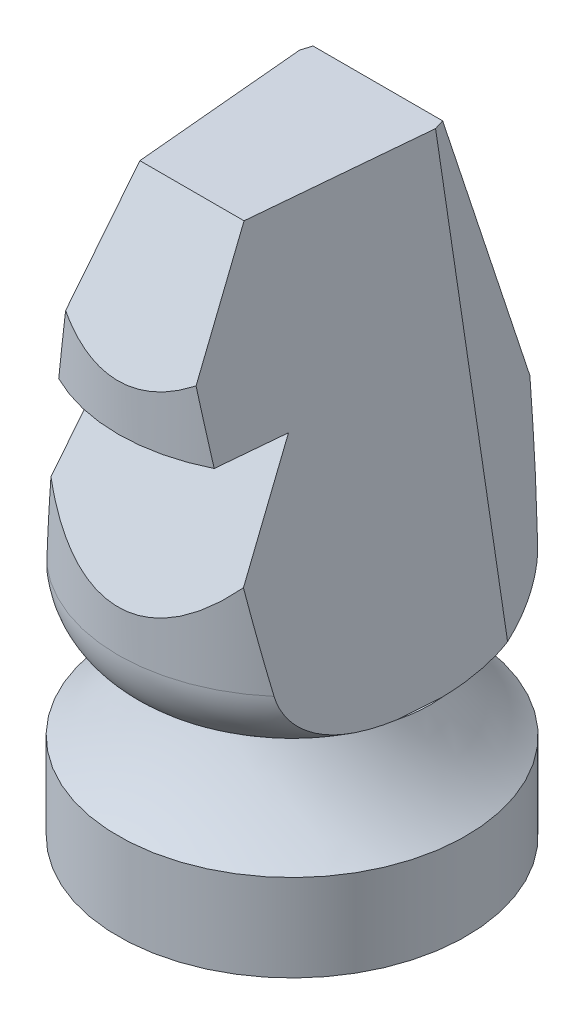
ISO-10303-21;
HEADER;
FILE_DESCRIPTION(('STEP AP214'),'2;1');
FILE_NAME('part.step','',(''),(''),'','','');
FILE_SCHEMA(('AUTOMOTIVE_DESIGN { 1 0 10303 214 1 1 1 1 }'));
ENDSEC;
DATA;
#1=APPLICATION_CONTEXT('core data for automotive mechanical design processes');
#2=APPLICATION_PROTOCOL_DEFINITION('international standard','automotive_design',2000,#1);
#3=PRODUCT_CONTEXT('',#1,'mechanical');
#4=PRODUCT('Part','Part','',(#3));
#5=PRODUCT_RELATED_PRODUCT_CATEGORY('part','',(#4));
#6=PRODUCT_DEFINITION_FORMATION('','',#4);
#7=PRODUCT_DEFINITION_CONTEXT('part definition',#1,'design');
#8=PRODUCT_DEFINITION('design','',#6,#7);
#9=PRODUCT_DEFINITION_SHAPE('','',#8);
#10=(LENGTH_UNIT() NAMED_UNIT(*) SI_UNIT(.MILLI.,.METRE.));
#11=(NAMED_UNIT(*) PLANE_ANGLE_UNIT() SI_UNIT($,.RADIAN.));
#12=(NAMED_UNIT(*) SI_UNIT($,.STERADIAN.) SOLID_ANGLE_UNIT());
#13=UNCERTAINTY_MEASURE_WITH_UNIT(LENGTH_MEASURE(1.E-05),#10,'distance_accuracy_value','');
#14=(GEOMETRIC_REPRESENTATION_CONTEXT(3) GLOBAL_UNCERTAINTY_ASSIGNED_CONTEXT((#13)) GLOBAL_UNIT_ASSIGNED_CONTEXT((#10,
#11,#12)) REPRESENTATION_CONTEXT('',''));
#15=CARTESIAN_POINT('',(0.,0.,0.));
#16=DIRECTION('',(0.,0.,1.));
#17=DIRECTION('',(1.,0.,0.));
#18=AXIS2_PLACEMENT_3D('',#15,#16,#17);
#19=CARTESIAN_POINT('',(0.,-12.,0.));
#20=DIRECTION('',(0.,-1.,0.));
#21=DIRECTION('',(0.,0.,-1.));
#22=AXIS2_PLACEMENT_3D('',#19,#20,#21);
#23=CYLINDRICAL_SURFACE('',#22,12.);
#24=CARTESIAN_POINT('',(0.,53.9211651668099,0.));
#25=DIRECTION('',(0.980923660509476,0.172963307363125,0.0887269212736395));
#26=DIRECTION('',(0.172260057914673,-0.98492826860945,0.0155813395195802));
#27=AXIS2_PLACEMENT_3D('',#24,#25,#26);
#28=ELLIPSE('',#27,69.3788768435539,12.);
#29=CARTESIAN_POINT('',(4.49918062175646,22.6983185299196,11.1246291503497));
#30=VERTEX_POINT('',#29);
#31=CARTESIAN_POINT('',(5.36286619745463,18.,10.7349739705413));
#32=VERTEX_POINT('',#31);
#33=EDGE_CURVE('E152',#30,#32,#28,.T.);
#34=ORIENTED_EDGE('',*,*,#33,.F.);
#35=CARTESIAN_POINT('',(0.,41.9667414336869,0.));
#36=DIRECTION('',(0.,-0.500000000000004,-0.866025403784437));
#37=DIRECTION('',(0.,-0.866025403784437,0.500000000000004));
#38=AXIS2_PLACEMENT_3D('',#35,#36,#37);
#39=ELLIPSE('',#38,23.9999999999998,12.);
#40=CARTESIAN_POINT('',(-4.49918062175645,22.6983185299196,11.1246291503497));
#41=VERTEX_POINT('',#40);
#42=EDGE_CURVE('E153',#30,#41,#39,.T.);
#43=ORIENTED_EDGE('',*,*,#42,.T.);
#44=CARTESIAN_POINT('',(0.,53.9211651668099,0.));
#45=DIRECTION('',(0.980923660509476,-0.172963307363125,-0.0887269212736395));
#46=DIRECTION('',(-0.172260057914673,-0.98492826860945,0.0155813395195802));
#47=AXIS2_PLACEMENT_3D('',#44,#45,#46);
#48=ELLIPSE('',#47,69.3788768435539,12.);
#49=CARTESIAN_POINT('',(-5.36286619745462,18.,10.7349739705413));
#50=VERTEX_POINT('',#49);
#51=EDGE_CURVE('E277',#41,#50,#48,.T.);
#52=ORIENTED_EDGE('',*,*,#51,.T.);
#53=CARTESIAN_POINT('',(0.,18.,0.));
#54=DIRECTION('',(0.,1.,0.));
#55=DIRECTION('',(0.,0.,1.));
#56=AXIS2_PLACEMENT_3D('',#53,#54,#55);
#57=CIRCLE('',#56,12.);
#58=EDGE_CURVE('E138',#50,#32,#57,.T.);
#59=ORIENTED_EDGE('',*,*,#58,.T.);
#60=EDGE_LOOP('',(#34,#43,#52,#59));
#61=FACE_BOUND('',#60,.T.);
#62=ADVANCED_FACE('F39',(#61),#23,.T.);
#63=CARTESIAN_POINT('',(0.,65.7780329498388,0.));
#64=DIRECTION('',(0.941615824446649,-0.166032275311983,0.292904289327391));
#65=DIRECTION('',(-0.158539089794211,-0.986120319005103,-0.0493160567411598));
#66=AXIS2_PLACEMENT_3D('',#63,#64,#65);
#67=ELLIPSE('',#66,72.2751042076088,12.);
#68=CARTESIAN_POINT('',(-7.95825768584024,4.80000000000004,-8.98143277020791));
#69=VERTEX_POINT('',#68);
#70=CARTESIAN_POINT('',(-6.01962565151632,13.3255846983598,-10.3809492348054));
#71=VERTEX_POINT('',#70);
#72=EDGE_CURVE('E278',#69,#71,#67,.T.);
#73=ORIENTED_EDGE('',*,*,#72,.T.);
#74=CARTESIAN_POINT('',(0.,52.0678146734472,0.));
#75=DIRECTION('',(0.,-0.258819045102518,0.965925826289069));
#76=DIRECTION('',(0.,-0.965925826289069,-0.258819045102518));
#77=AXIS2_PLACEMENT_3D('',#74,#75,#76);
#78=ELLIPSE('',#77,46.3644396618758,12.);
#79=CARTESIAN_POINT('',(6.01962565151633,13.3255846983598,-10.3809492348054));
#80=VERTEX_POINT('',#79);
#81=EDGE_CURVE('E54',#71,#80,#78,.T.);
#82=ORIENTED_EDGE('',*,*,#81,.T.);
#83=CARTESIAN_POINT('',(0.,65.7780329498388,0.));
#84=DIRECTION('',(0.941615824446649,0.166032275311983,-0.292904289327391));
#85=DIRECTION('',(0.158539089794211,-0.986120319005103,-0.0493160567411598));
#86=AXIS2_PLACEMENT_3D('',#83,#84,#85);
#87=ELLIPSE('',#86,72.2751042076088,12.);
#88=CARTESIAN_POINT('',(7.95825768584024,4.80000000000004,-8.98143277020791));
#89=VERTEX_POINT('',#88);
#90=EDGE_CURVE('E265',#89,#80,#87,.T.);
#91=ORIENTED_EDGE('',*,*,#90,.F.);
#92=CARTESIAN_POINT('',(0.,4.80000000000004,0.));
#93=DIRECTION('',(0.,-1.,0.));
#94=DIRECTION('',(0.,0.,-1.));
#95=AXIS2_PLACEMENT_3D('',#92,#93,#94);
#96=CIRCLE('',#95,12.);
#97=EDGE_CURVE('E250',#69,#89,#96,.T.);
#98=ORIENTED_EDGE('',*,*,#97,.F.);
#99=EDGE_LOOP('',(#73,#82,#91,#98));
#100=FACE_BOUND('',#99,.T.);
#101=ADVANCED_FACE('F312',(#100),#23,.T.);
#102=CARTESIAN_POINT('',(0.,30.,0.));
#103=DIRECTION('',(0.,-1.,0.));
#104=DIRECTION('',(0.,0.,-1.));
#105=AXIS2_PLACEMENT_3D('',#102,#103,#104);
#106=PLANE('',#105);
#107=DIRECTION('',(0.297026928339639,0.,0.954869102988006));
#108=VECTOR('',#107,1.);
#109=CARTESIAN_POINT('',(5.75205344538225,30.,-1.78926594355288));
#110=LINE('',#109,#108);
#111=CARTESIAN_POINT('',(4.46928512200358,30.,-5.91305312046978));
#112=VERTEX_POINT('',#111);
#113=CARTESIAN_POINT('',(4.68892839442264,30.,-5.20695359042203));
#114=VERTEX_POINT('',#113);
#115=EDGE_CURVE('E248',#112,#114,#110,.T.);
#116=ORIENTED_EDGE('',*,*,#115,.F.);
#117=DIRECTION('',(-1.,0.,0.));
#118=VECTOR('',#117,1.);
#119=CARTESIAN_POINT('',(0.,30.,-5.91305312046978));
#120=LINE('',#119,#118);
#121=CARTESIAN_POINT('',(-4.46928512200358,30.,-5.91305312046978));
#122=VERTEX_POINT('',#121);
#123=EDGE_CURVE('E164',#112,#122,#120,.T.);
#124=ORIENTED_EDGE('',*,*,#123,.T.);
#125=DIRECTION('',(-0.297026928339639,0.,0.954869102988006));
#126=VECTOR('',#125,1.);
#127=CARTESIAN_POINT('',(-5.75205344538225,30.,-1.78926594355288));
#128=LINE('',#127,#126);
#129=CARTESIAN_POINT('',(-4.68892839442264,30.,-5.20695359042203));
#130=VERTEX_POINT('',#129);
#131=EDGE_CURVE('E216',#122,#130,#128,.T.);
#132=ORIENTED_EDGE('',*,*,#131,.T.);
#133=DIRECTION('',(0.0900846529655471,0.,0.995934111927128));
#134=VECTOR('',#133,1.);
#135=CARTESIAN_POINT('',(-4.18371715824421,30.,0.378427351561597));
#136=LINE('',#135,#134);
#137=CARTESIAN_POINT('',(-3.59301091703958,30.,6.90900138806188));
#138=VERTEX_POINT('',#137);
#139=EDGE_CURVE('E185',#130,#138,#136,.T.);
#140=ORIENTED_EDGE('',*,*,#139,.T.);
#141=DIRECTION('',(1.,0.,0.));
#142=VECTOR('',#141,1.);
#143=CARTESIAN_POINT('',(0.,30.,6.90900138806188));
#144=LINE('',#143,#142);
#145=CARTESIAN_POINT('',(3.59301091703958,30.,6.90900138806188));
#146=VERTEX_POINT('',#145);
#147=EDGE_CURVE('E156',#138,#146,#144,.T.);
#148=ORIENTED_EDGE('',*,*,#147,.T.);
#149=DIRECTION('',(-0.0900846529655471,0.,0.995934111927128));
#150=VECTOR('',#149,1.);
#151=CARTESIAN_POINT('',(4.18371715824421,30.,0.378427351561597));
#152=LINE('',#151,#150);
#153=EDGE_CURVE('E230',#114,#146,#152,.T.);
#154=ORIENTED_EDGE('',*,*,#153,.F.);
#155=EDGE_LOOP('',(#116,#124,#132,#140,#148,#154));
#156=FACE_BOUND('',#155,.T.);
#157=ADVANCED_FACE('F41',(#156),#106,.F.);
#158=CARTESIAN_POINT('',(0.,4.8,0.));
#159=DIRECTION('',(0.,-1.,0.));
#160=DIRECTION('',(0.,0.,-1.));
#161=AXIS2_PLACEMENT_3D('',#158,#159,#160);
#162=TOROIDAL_SURFACE('',#161,7.2,4.8);
#163=CARTESIAN_POINT('',(0.,0.,0.));
#164=DIRECTION('',(0.,-1.,0.));
#165=DIRECTION('',(0.,0.,-1.));
#166=AXIS2_PLACEMENT_3D('',#163,#164,#165);
#167=CIRCLE('',#166,7.2);
#168=CARTESIAN_POINT('',(0.,0.,-7.2));
#169=VERTEX_POINT('',#168);
#170=EDGE_CURVE('E254',#169,#169,#167,.T.);
#171=ORIENTED_EDGE('',*,*,#170,.F.);
#172=EDGE_LOOP('',(#171));
#173=FACE_BOUND('',#172,.T.);
#174=CARTESIAN_POINT('',(-7.83958716595199,4.80012000000004,9.08520077001278));
#175=CARTESIAN_POINT('',(-7.86121208851358,4.6870369386895,9.06656856816696));
#176=CARTESIAN_POINT('',(-7.88316902619503,4.57501841459272,9.04219056384416));
#177=CARTESIAN_POINT('',(-7.92750622899715,4.35408998113852,8.98269454332597));
#178=CARTESIAN_POINT('',(-7.94988598673528,4.24517669613272,8.94758871696899));
#179=CARTESIAN_POINT('',(-7.99467522365612,4.03214316722891,8.86770497490255));
#180=CARTESIAN_POINT('',(-8.01708261532408,3.92798856045781,8.82301712440291));
#181=CARTESIAN_POINT('',(-8.06194313220552,3.72405891443603,8.72459833266508));
#182=CARTESIAN_POINT('',(-8.0843962677888,3.62428502011042,8.6708650448785));
#183=CARTESIAN_POINT('',(-8.15136561993955,3.3332279836703,8.49786643093667));
#184=CARTESIAN_POINT('',(-8.19573343632513,3.14906583202993,8.3663601659673));
#185=CARTESIAN_POINT('',(-8.28311588797338,2.80197231007033,8.07692072138833));
#186=CARTESIAN_POINT('',(-8.32612632278419,2.63910271450314,7.91891355698676));
#187=CARTESIAN_POINT('',(-8.39939473214557,2.37413585180603,7.62541558565029));
#188=CARTESIAN_POINT('',(-8.43011471668868,2.26711555352986,7.49441391471276));
#189=CARTESIAN_POINT('',(-8.49027887539542,2.06505501564327,7.22316154255585));
#190=CARTESIAN_POINT('',(-8.51972243459007,1.9700205094807,7.08290646342639));
#191=CARTESIAN_POINT('',(-8.605974490357,1.7023200556258,6.65119615681178));
#192=CARTESIAN_POINT('',(-8.66076127925347,1.54685413085096,6.34856245110995));
#193=CARTESIAN_POINT('',(-8.75445013407004,1.3033900603685,5.78738820042993));
#194=CARTESIAN_POINT('',(-8.79434681801247,1.20812548683323,5.53201671659451));
#195=CARTESIAN_POINT('',(-8.87089208611182,1.04007872617214,5.01335631000648));
#196=CARTESIAN_POINT('',(-8.90753846027515,0.967311753599466,4.75006216083081));
#197=CARTESIAN_POINT('',(-8.97813952299317,0.840598352231894,4.21654332336928));
#198=CARTESIAN_POINT('',(-9.01207107203501,0.7868026297126,3.94628066960262));
#199=CARTESIAN_POINT('',(-9.07728111225535,0.69578618202282,3.40277521662616));
#200=CARTESIAN_POINT('',(-9.10856013867685,0.658562106445889,3.12953303126445));
#201=CARTESIAN_POINT('',(-9.16712860568242,0.599884953789099,2.59641185477865));
#202=CARTESIAN_POINT('',(-9.19454295307507,0.577674955530917,2.33662748596766));
#203=CARTESIAN_POINT('',(-9.24749601100205,0.54437288176071,1.81612175971656));
#204=CARTESIAN_POINT('',(-9.27303436785777,0.533282897733856,1.55540023526436));
#205=CARTESIAN_POINT('',(-9.32236635918554,0.5214262100295,1.03312193541407));
#206=CARTESIAN_POINT('',(-9.34615698906202,0.520676888588156,0.771564492685757));
#207=CARTESIAN_POINT('',(-9.39191688906648,0.529490550012923,0.248483019997268));
#208=CARTESIAN_POINT('',(-9.41388632454878,0.539052595557562,-0.0130410108390146));
#209=CARTESIAN_POINT('',(-9.45560742746959,0.569007780653478,-0.532684476684622));
#210=CARTESIAN_POINT('',(-9.47538129015738,0.589277694386087,-0.790809076980796));
#211=CARTESIAN_POINT('',(-9.51270552858124,0.6419144578963,-1.30605807502826));
#212=CARTESIAN_POINT('',(-9.53025552373239,0.67428337452129,-1.56318229429937));
#213=CARTESIAN_POINT('',(-9.56266806691687,0.752936957742215,-2.07484677837152));
#214=CARTESIAN_POINT('',(-9.57753715737996,0.799186992680636,-2.3293918626584));
#215=CARTESIAN_POINT('',(-9.60409620527691,0.907975006733238,-2.83508655543771));
#216=CARTESIAN_POINT('',(-9.61578795138677,0.97050378279846,-3.08623799837708));
#217=CARTESIAN_POINT('',(-9.63195708637842,1.08956092754868,-3.49708516946352));
#218=CARTESIAN_POINT('',(-9.63753048953863,1.14066011864135,-3.65831434228989));
#219=CARTESIAN_POINT('',(-9.64683699753489,1.25172929464292,-3.9777198340028));
#220=CARTESIAN_POINT('',(-9.6505705638736,1.31169705005899,-4.13589690889929));
#221=CARTESIAN_POINT('',(-9.65599566630988,1.44170747943779,-4.44931525812533));
#222=CARTESIAN_POINT('',(-9.65767399486233,1.51181211257375,-4.6045312985129));
#223=CARTESIAN_POINT('',(-9.65870493329967,1.66263098326022,-4.9099335620362));
#224=CARTESIAN_POINT('',(-9.65805487338045,1.7433572977823,-5.06011381177536));
#225=CARTESIAN_POINT('',(-9.65611828556887,1.82972783349394,-5.20707359042203));
#226=B_SPLINE_CURVE_WITH_KNOTS('',3,(#174,#175,#176,#177,#178,#179,#180,#181,#182,#183,#184,
#185,#186,#187,#188,#189,#190,#191,#192,#193,#194,#195,#196,#197,#198,#199,#200,#201,#202,#203,
#204,#205,#206,#207,#208,#209,#210,#211,#212,#213,#214,#215,#216,#217,#218,#219,#220,#221,#222,
#223,#224,#225),.UNSPECIFIED.,.F.,.F.,(4,2,2,2,2,2,2,2,2,2,2,2,2,2,2,2,2,2,2,2,2,2,2,2,2,4),(0.,
0.349667533225213,0.698939213443814,1.04506159037819,1.39127389641652,2.07999708758635,
2.77067606572291,3.2857516707719,3.80107273708607,4.83078286929309,5.65613474818903,
6.48204357670804,7.31437292486878,8.14653391864289,8.93277494502844,9.71916382222942,
10.5068744266638,11.2945134328484,12.0732796771467,12.8521790173007,13.629151029999,
14.4056847384021,14.9131292743401,15.4204464585677,15.9310069830356,16.4421531197214),.UNSPECIFIED.);
#227=CARTESIAN_POINT('',(-9.48222530443842,0.599917834625194,-0.887215097441334));
#228=VERTEX_POINT('',#227);
#229=CARTESIAN_POINT('',(-9.65611986818043,1.82965730031634,-5.20695359042203));
#230=VERTEX_POINT('',#229);
#231=EDGE_CURVE('E186',#228,#230,#226,.T.);
#232=ORIENTED_EDGE('',*,*,#231,.T.);
#233=CARTESIAN_POINT('',(-9.65616170238532,1.82963174363104,-5.20683359042203));
#234=CARTESIAN_POINT('',(-9.62361354218431,1.84951795347087,-5.30019552137106));
#235=CARTESIAN_POINT('',(-9.59091163199555,1.8709660678847,-5.39316635818817));
#236=CARTESIAN_POINT('',(-9.52521048414884,1.91714182860571,-5.57820487027163));
#237=CARTESIAN_POINT('',(-9.49221118850616,1.94187012797416,-5.67027236175808));
#238=CARTESIAN_POINT('',(-9.3925886351762,2.02136650034707,-5.94547218654814));
#239=CARTESIAN_POINT('',(-9.32555059730086,2.08131996265029,-6.12699860825514));
#240=CARTESIAN_POINT('',(-9.18995264931809,2.21712626588001,-6.48593136508691));
#241=CARTESIAN_POINT('',(-9.12138414591258,2.29314004312699,-6.66327409910136));
#242=CARTESIAN_POINT('',(-8.98395597097827,2.46220579377501,-7.00923753042649));
#243=CARTESIAN_POINT('',(-8.91509691246111,2.55523127949942,-7.17787127154666));
#244=CARTESIAN_POINT('',(-8.77402468364715,2.76557177821366,-7.51215292947064));
#245=CARTESIAN_POINT('',(-8.70182605897451,2.88390873437338,-7.67717479897398));
#246=CARTESIAN_POINT('',(-8.55909239159374,3.14312307256977,-7.98909352755457));
#247=CARTESIAN_POINT('',(-8.48855532695583,3.28397124153422,-8.13601344602077));
#248=CARTESIAN_POINT('',(-8.34995181084668,3.59170879776899,-8.4071494461595));
#249=CARTESIAN_POINT('',(-8.28193307545209,3.75893167535235,-8.53102309389725));
#250=CARTESIAN_POINT('',(-8.185069106616,4.02662752499655,-8.69067420373298));
#251=CARTESIAN_POINT('',(-8.15368018947088,4.11853615691538,-8.73948366927759));
#252=CARTESIAN_POINT('',(-8.09303911403356,4.30756227276064,-8.82728081350899));
#253=CARTESIAN_POINT('',(-8.06378472015036,4.40467411664631,-8.86627887612242));
#254=CARTESIAN_POINT('',(-8.02225369717391,4.55235969094845,-8.91607567678193));
#255=CARTESIAN_POINT('',(-8.00896329205589,4.60126299788801,-8.9310803339724));
#256=CARTESIAN_POINT('',(-7.98306754069698,4.70001222125774,-8.95835303469814));
#257=CARTESIAN_POINT('',(-7.97046229248898,4.74985827120831,-8.9706206873958));
#258=CARTESIAN_POINT('',(-7.95822847625336,4.80012000000007,-8.98145865011636));
#259=B_SPLINE_CURVE_WITH_KNOTS('',3,(#233,#234,#235,#236,#237,#238,#239,#240,#241,#242,#243,
#244,#245,#246,#247,#248,#249,#250,#251,#252,#253,#254,#255,#256,#257,#258),.UNSPECIFIED.,.F.,
.F.,(4,2,2,2,2,2,2,2,2,2,2,2,4),(0.,0.302533180730461,0.605126684302472,1.21226262426543,
1.82579849038476,2.43838707524965,3.08326939195998,3.72732153244219,4.38028906192598,
4.7059066531777,5.0311781625064,5.18966108045114,5.34816661490814),.UNSPECIFIED.);
#260=EDGE_CURVE('E209',#230,#69,#259,.T.);
#261=ORIENTED_EDGE('',*,*,#260,.T.);
#262=ORIENTED_EDGE('',*,*,#97,.T.);
#263=CARTESIAN_POINT('',(9.65616170238532,1.82963174363104,-5.20683359042203));
#264=CARTESIAN_POINT('',(9.62361354218431,1.84951795347087,-5.30019552137106));
#265=CARTESIAN_POINT('',(9.59091163199555,1.8709660678847,-5.39316635818817));
#266=CARTESIAN_POINT('',(9.52521048414884,1.91714182860571,-5.57820487027163));
#267=CARTESIAN_POINT('',(9.49221118850616,1.94187012797416,-5.67027236175809));
#268=CARTESIAN_POINT('',(9.3925886351762,2.02136650034707,-5.94547218654814));
#269=CARTESIAN_POINT('',(9.32555059730086,2.08131996265029,-6.12699860825514));
#270=CARTESIAN_POINT('',(9.18995264931809,2.21712626588001,-6.48593136508691));
#271=CARTESIAN_POINT('',(9.12138414591258,2.29314004312699,-6.66327409910136));
#272=CARTESIAN_POINT('',(8.98395597097827,2.46220579377501,-7.00923753042649));
#273=CARTESIAN_POINT('',(8.91509691246111,2.55523127949942,-7.17787127154666));
#274=CARTESIAN_POINT('',(8.77402468364715,2.76557177821366,-7.51215292947064));
#275=CARTESIAN_POINT('',(8.70182605897451,2.88390873437338,-7.67717479897398));
#276=CARTESIAN_POINT('',(8.55909239159374,3.14312307256978,-7.98909352755457));
#277=CARTESIAN_POINT('',(8.48855532695582,3.28397124153422,-8.13601344602077));
#278=CARTESIAN_POINT('',(8.34995181084668,3.59170879776899,-8.40714944615951));
#279=CARTESIAN_POINT('',(8.28193307545209,3.75893167535235,-8.53102309389725));
#280=CARTESIAN_POINT('',(8.185069106616,4.02662752499655,-8.69067420373298));
#281=CARTESIAN_POINT('',(8.15368018947088,4.11853615691538,-8.7394836692776));
#282=CARTESIAN_POINT('',(8.09303911403355,4.30756227276065,-8.827280813509));
#283=CARTESIAN_POINT('',(8.06378472015036,4.40467411664631,-8.86627887612243));
#284=CARTESIAN_POINT('',(8.0222536971739,4.55235969094845,-8.91607567678193));
#285=CARTESIAN_POINT('',(8.00896329205589,4.601262997888,-8.93108033397239));
#286=CARTESIAN_POINT('',(7.98306754069699,4.70001222125772,-8.95835303469813));
#287=CARTESIAN_POINT('',(7.97046229248899,4.74985827120829,-8.97062068739579));
#288=CARTESIAN_POINT('',(7.95822847625337,4.80012000000004,-8.98145865011635));
#289=B_SPLINE_CURVE_WITH_KNOTS('',3,(#263,#264,#265,#266,#267,#268,#269,#270,#271,#272,#273,
#274,#275,#276,#277,#278,#279,#280,#281,#282,#283,#284,#285,#286,#287,#288),.UNSPECIFIED.,.F.,
.F.,(4,2,2,2,2,2,2,2,2,2,2,2,4),(0.,0.302533180730462,0.605126684302475,1.21226262426544,
1.82579849038476,2.43838707524965,3.08326939195999,3.72732153244219,4.38028906192599,
4.7059066531777,5.0311781625064,5.18966108045112,5.3481666149081),.UNSPECIFIED.);
#290=CARTESIAN_POINT('',(9.65611986818043,1.82965730031634,-5.20695359042203));
#291=VERTEX_POINT('',#290);
#292=EDGE_CURVE('E241',#291,#89,#289,.T.);
#293=ORIENTED_EDGE('',*,*,#292,.F.);
#294=CARTESIAN_POINT('',(7.83958716595199,4.80012000000004,9.08520077001278));
#295=CARTESIAN_POINT('',(7.86121208851358,4.6870369386895,9.06656856816696));
#296=CARTESIAN_POINT('',(7.88316902619503,4.57501841459272,9.04219056384416));
#297=CARTESIAN_POINT('',(7.92750622899715,4.35408998113852,8.98269454332597));
#298=CARTESIAN_POINT('',(7.94988598673528,4.24517669613272,8.94758871696899));
#299=CARTESIAN_POINT('',(7.99467522365612,4.03214316722891,8.86770497490255));
#300=CARTESIAN_POINT('',(8.01708261532408,3.92798856045781,8.82301712440291));
#301=CARTESIAN_POINT('',(8.06194313220552,3.72405891443603,8.72459833266508));
#302=CARTESIAN_POINT('',(8.0843962677888,3.62428502011042,8.6708650448785));
#303=CARTESIAN_POINT('',(8.15136561993955,3.3332279836703,8.49786643093667));
#304=CARTESIAN_POINT('',(8.19573343632513,3.14906583202993,8.3663601659673));
#305=CARTESIAN_POINT('',(8.28311588797338,2.80197231007033,8.07692072138833));
#306=CARTESIAN_POINT('',(8.32612632278419,2.63910271450314,7.91891355698676));
#307=CARTESIAN_POINT('',(8.39939473214557,2.37413585180603,7.62541558565029));
#308=CARTESIAN_POINT('',(8.43011471668868,2.26711555352986,7.49441391471276));
#309=CARTESIAN_POINT('',(8.49027887539542,2.06505501564327,7.22316154255585));
#310=CARTESIAN_POINT('',(8.51972243459007,1.9700205094807,7.08290646342639));
#311=CARTESIAN_POINT('',(8.605974490357,1.7023200556258,6.65119615681178));
#312=CARTESIAN_POINT('',(8.66076127925347,1.54685413085096,6.34856245110995));
#313=CARTESIAN_POINT('',(8.75445013407004,1.3033900603685,5.78738820042993));
#314=CARTESIAN_POINT('',(8.79434681801247,1.20812548683323,5.53201671659451));
#315=CARTESIAN_POINT('',(8.87089208611182,1.04007872617214,5.01335631000648));
#316=CARTESIAN_POINT('',(8.90753846027515,0.967311753599466,4.75006216083081));
#317=CARTESIAN_POINT('',(8.97813952299317,0.840598352231894,4.21654332336928));
#318=CARTESIAN_POINT('',(9.01207107203501,0.7868026297126,3.94628066960262));
#319=CARTESIAN_POINT('',(9.07728111225535,0.69578618202282,3.40277521662616));
#320=CARTESIAN_POINT('',(9.10856013867685,0.658562106445889,3.12953303126445));
#321=CARTESIAN_POINT('',(9.16712860568242,0.599884953789099,2.59641185477865));
#322=CARTESIAN_POINT('',(9.19454295307507,0.577674955530917,2.33662748596766));
#323=CARTESIAN_POINT('',(9.24749601100205,0.54437288176071,1.81612175971656));
#324=CARTESIAN_POINT('',(9.27303436785777,0.533282897733856,1.55540023526436));
#325=CARTESIAN_POINT('',(9.32236635918554,0.5214262100295,1.03312193541407));
#326=CARTESIAN_POINT('',(9.34615698906202,0.520676888588156,0.771564492685757));
#327=CARTESIAN_POINT('',(9.39191688906648,0.529490550012923,0.248483019997268));
#328=CARTESIAN_POINT('',(9.41388632454878,0.539052595557562,-0.0130410108390146));
#329=CARTESIAN_POINT('',(9.45560742746959,0.569007780653478,-0.532684476684622));
#330=CARTESIAN_POINT('',(9.47538129015738,0.589277694386087,-0.790809076980796));
#331=CARTESIAN_POINT('',(9.51270552858124,0.6419144578963,-1.30605807502826));
#332=CARTESIAN_POINT('',(9.53025552373239,0.67428337452129,-1.56318229429937));
#333=CARTESIAN_POINT('',(9.56266806691687,0.752936957742215,-2.07484677837152));
#334=CARTESIAN_POINT('',(9.57753715737996,0.799186992680636,-2.3293918626584));
#335=CARTESIAN_POINT('',(9.60409620527691,0.907975006733238,-2.83508655543771));
#336=CARTESIAN_POINT('',(9.61578795138677,0.97050378279846,-3.08623799837708));
#337=CARTESIAN_POINT('',(9.63195708637842,1.08956092754868,-3.49708516946352));
#338=CARTESIAN_POINT('',(9.63753048953863,1.14066011864135,-3.65831434228989));
#339=CARTESIAN_POINT('',(9.64683699753489,1.25172929464292,-3.9777198340028));
#340=CARTESIAN_POINT('',(9.6505705638736,1.31169705005899,-4.13589690889929));
#341=CARTESIAN_POINT('',(9.65599566630988,1.44170747943779,-4.44931525812533));
#342=CARTESIAN_POINT('',(9.65767399486233,1.51181211257375,-4.6045312985129));
#343=CARTESIAN_POINT('',(9.65870493329967,1.66263098326022,-4.9099335620362));
#344=CARTESIAN_POINT('',(9.65805487338045,1.7433572977823,-5.06011381177536));
#345=CARTESIAN_POINT('',(9.65611828556887,1.82972783349394,-5.20707359042203));
#346=B_SPLINE_CURVE_WITH_KNOTS('',3,(#294,#295,#296,#297,#298,#299,#300,#301,#302,#303,#304,
#305,#306,#307,#308,#309,#310,#311,#312,#313,#314,#315,#316,#317,#318,#319,#320,#321,#322,#323,
#324,#325,#326,#327,#328,#329,#330,#331,#332,#333,#334,#335,#336,#337,#338,#339,#340,#341,#342,
#343,#344,#345),.UNSPECIFIED.,.F.,.F.,(4,2,2,2,2,2,2,2,2,2,2,2,2,2,2,2,2,2,2,2,2,2,2,2,2,4),(0.,
0.349667533225213,0.698939213443814,1.04506159037819,1.39127389641652,2.07999708758635,
2.77067606572291,3.2857516707719,3.80107273708607,4.83078286929309,5.65613474818903,
6.48204357670804,7.31437292486878,8.14653391864289,8.93277494502844,9.71916382222942,
10.5068744266638,11.2945134328484,12.0732796771467,12.8521790173007,13.629151029999,
14.4056847384021,14.9131292743401,15.4204464585677,15.9310069830356,16.4421531197214),.UNSPECIFIED.);
#347=CARTESIAN_POINT('',(9.48222530443711,0.599917834624963,-0.887215097426375));
#348=VERTEX_POINT('',#347);
#349=EDGE_CURVE('E231',#348,#291,#346,.T.);
#350=ORIENTED_EDGE('',*,*,#349,.F.);
#351=CARTESIAN_POINT('',(7.5810223161346,0.264684451983683,-4.4130003078152));
#352=CARTESIAN_POINT('',(7.68218655206482,0.282522436260937,-4.3412358626267));
#353=CARTESIAN_POINT('',(7.77880621169741,0.299559089121031,-4.26332140036474));
#354=CARTESIAN_POINT('',(7.96319506501734,0.332071818903228,-4.09779143248742));
#355=CARTESIAN_POINT('',(8.05098789045546,0.347552062740598,-4.0102032227749));
#356=CARTESIAN_POINT('',(8.21787941181404,0.376979540807597,-3.82819477233408));
#357=CARTESIAN_POINT('',(8.29703887063936,0.390937489176781,-3.73383124639022));
#358=CARTESIAN_POINT('',(8.44774486813069,0.417511022689083,-3.53894098344993));
#359=CARTESIAN_POINT('',(8.51928429840709,0.430125354431325,-3.4384086272205));
#360=CARTESIAN_POINT('',(8.75853163778926,0.472311115427115,-3.07482951186384));
#361=CARTESIAN_POINT('',(8.90631719502103,0.49836969652611,-2.79799145829496));
#362=CARTESIAN_POINT('',(9.15620362775353,0.542431416729839,-2.22309716919845));
#363=CARTESIAN_POINT('',(9.2581214712553,0.560402282354822,-1.92496133087305));
#364=CARTESIAN_POINT('',(9.41731171927733,0.588471818146779,-1.31239476302824));
#365=CARTESIAN_POINT('',(9.47396931656026,0.598462081209873,-0.997799521028757));
#366=CARTESIAN_POINT('',(9.54051925807497,0.610196631463486,-0.364053421714864));
#367=CARTESIAN_POINT('',(9.55047141867989,0.611951465894477,-0.0449089167337567));
#368=CARTESIAN_POINT('',(9.52218693478752,0.606964148248839,0.63045990546283));
#369=CARTESIAN_POINT('',(9.47789940339229,0.599155061554887,0.986438625293341));
#370=CARTESIAN_POINT('',(9.33025490652005,0.573121353203186,1.68634020748693));
#371=CARTESIAN_POINT('',(9.22681220765121,0.554881614435309,2.03024480136476));
#372=CARTESIAN_POINT('',(8.99029063719263,0.513176480043925,2.61836640073924));
#373=CARTESIAN_POINT('',(8.86915710387181,0.491817369850917,2.86757365615983));
#374=CARTESIAN_POINT('',(8.59065860443945,0.442710570314173,3.34311719538585));
#375=CARTESIAN_POINT('',(8.43347681761978,0.414995180421899,3.56956105599225));
#376=CARTESIAN_POINT('',(8.15754201924061,0.366340430551304,3.89790966376569));
#377=CARTESIAN_POINT('',(8.05183090500149,0.347700708950193,4.01112851780822));
#378=CARTESIAN_POINT('',(7.88327923925947,0.31798050263652,4.17058393162637));
#379=CARTESIAN_POINT('',(7.82529275454806,0.30775592086546,4.22210860550725));
#380=CARTESIAN_POINT('',(7.70581397924322,0.286688589157213,4.32093011991501));
#381=CARTESIAN_POINT('',(7.64431739265567,0.275845081720355,4.36822158951592));
#382=CARTESIAN_POINT('',(7.5810223161346,0.264684451983683,4.41300030781521));
#383=B_SPLINE_CURVE_WITH_KNOTS('',3,(#351,#352,#353,#354,#355,#356,#357,#358,#359,#360,#361,
#362,#363,#364,#365,#366,#367,#368,#369,#370,#371,#372,#373,#374,#375,#376,#377,#378,#379,#380,
#381,#382),.UNSPECIFIED.,.F.,.F.,(4,2,2,2,2,2,2,2,2,2,2,2,2,2,2,4),(0.,0.375314561637784,
0.749595940971893,1.1210450620108,1.49283771162015,2.43223933412362,3.37535704024841,
4.3310778431172,5.28557430497061,6.35696667524931,7.42991576054362,8.26088256178758,
9.08771686178035,9.55474631911241,9.78929370016442,10.0241345683761),.UNSPECIFIED.);
#384=CARTESIAN_POINT('',(9.23016411676813,0.555472646449503,1.98609737599503));
#385=VERTEX_POINT('',#384);
#386=EDGE_CURVE('E268',#348,#385,#383,.T.);
#387=ORIENTED_EDGE('',*,*,#386,.T.);
#388=CARTESIAN_POINT('',(7.83961011631549,4.80000000000004,9.08518096815709));
#389=VERTEX_POINT('',#388);
#390=EDGE_CURVE('E224',#389,#385,#346,.T.);
#391=ORIENTED_EDGE('',*,*,#390,.F.);
#392=CARTESIAN_POINT('',(-7.83961011631549,4.80000000000004,9.08518096815709));
#393=VERTEX_POINT('',#392);
#394=EDGE_CURVE('E251',#389,#393,#96,.T.);
#395=ORIENTED_EDGE('',*,*,#394,.T.);
#396=CARTESIAN_POINT('',(-9.2301641167691,0.555472646449675,1.9860973759839));
#397=VERTEX_POINT('',#396);
#398=EDGE_CURVE('E176',#393,#397,#226,.T.);
#399=ORIENTED_EDGE('',*,*,#398,.T.);
#400=CARTESIAN_POINT('',(-7.5810223161346,0.264684451983683,4.41300030781521));
#401=CARTESIAN_POINT('',(-7.68218655206482,0.282522436260937,4.34123586262671));
#402=CARTESIAN_POINT('',(-7.77880621169741,0.299559089121031,4.26332140036475));
#403=CARTESIAN_POINT('',(-7.96319506501734,0.332071818903228,4.09779143248744));
#404=CARTESIAN_POINT('',(-8.05098789045546,0.347552062740598,4.01020322277491));
#405=CARTESIAN_POINT('',(-8.21787941181404,0.376979540807597,3.82819477233409));
#406=CARTESIAN_POINT('',(-8.29703887063936,0.390937489176781,3.73383124639023));
#407=CARTESIAN_POINT('',(-8.44774486813069,0.417511022689083,3.53894098344994));
#408=CARTESIAN_POINT('',(-8.51928429840709,0.430125354431324,3.43840862722051));
#409=CARTESIAN_POINT('',(-8.75853163778926,0.472311115427114,3.07482951186384));
#410=CARTESIAN_POINT('',(-8.90631719502103,0.49836969652611,2.79799145829497));
#411=CARTESIAN_POINT('',(-9.15620362775353,0.542431416729839,2.22309716919845));
#412=CARTESIAN_POINT('',(-9.25812147125529,0.560402282354822,1.92496133087306));
#413=CARTESIAN_POINT('',(-9.41731171927733,0.588471818146779,1.31239476302824));
#414=CARTESIAN_POINT('',(-9.47396931656026,0.598462081209874,0.997799521028762));
#415=CARTESIAN_POINT('',(-9.54051925807497,0.610196631463486,0.364053421714868));
#416=CARTESIAN_POINT('',(-9.55047141867989,0.611951465894477,0.0449089167337606));
#417=CARTESIAN_POINT('',(-9.52218693478752,0.606964148248839,-0.630459905462827));
#418=CARTESIAN_POINT('',(-9.47789940339229,0.599155061554887,-0.986438625293337));
#419=CARTESIAN_POINT('',(-9.33025490652005,0.573121353203186,-1.68634020748693));
#420=CARTESIAN_POINT('',(-9.22681220765121,0.554881614435309,-2.03024480136476));
#421=CARTESIAN_POINT('',(-8.99029063719263,0.513176480043925,-2.61836640073923));
#422=CARTESIAN_POINT('',(-8.86915710387181,0.491817369850917,-2.86757365615982));
#423=CARTESIAN_POINT('',(-8.59065860443946,0.442710570314173,-3.34311719538584));
#424=CARTESIAN_POINT('',(-8.43347681761978,0.414995180421899,-3.56956105599224));
#425=CARTESIAN_POINT('',(-8.15754201924061,0.366340430551303,-3.89790966376568));
#426=CARTESIAN_POINT('',(-8.05183090500149,0.347700708950192,-4.0111285178082));
#427=CARTESIAN_POINT('',(-7.88327923925947,0.31798050263652,-4.17058393162636));
#428=CARTESIAN_POINT('',(-7.82529275454806,0.30775592086546,-4.22210860550724));
#429=CARTESIAN_POINT('',(-7.70581397924322,0.286688589157213,-4.320930119915));
#430=CARTESIAN_POINT('',(-7.64431739265567,0.275845081720355,-4.3682215895159));
#431=CARTESIAN_POINT('',(-7.5810223161346,0.264684451983683,-4.4130003078152));
#432=B_SPLINE_CURVE_WITH_KNOTS('',3,(#400,#401,#402,#403,#404,#405,#406,#407,#408,#409,#410,
#411,#412,#413,#414,#415,#416,#417,#418,#419,#420,#421,#422,#423,#424,#425,#426,#427,#428,#429,
#430,#431),.UNSPECIFIED.,.F.,.F.,(4,2,2,2,2,2,2,2,2,2,2,2,2,2,2,4),(0.,0.375314561637785,
0.749595940971894,1.1210450620108,1.49283771162015,2.43223933412362,3.37535704024842,
4.33107784311721,5.28557430497062,6.35696667524931,7.42991576054362,8.26088256178758,
9.08771686178035,9.55474631911241,9.78929370016442,10.0241345683761),.UNSPECIFIED.);
#433=EDGE_CURVE('E281',#397,#228,#432,.T.);
#434=ORIENTED_EDGE('',*,*,#433,.T.);
#435=EDGE_LOOP('',(#232,#261,#262,#293,#350,#387,#391,#395,#399,#434));
#436=FACE_BOUND('',#435,.T.);
#437=ADVANCED_FACE('F188',(#173,#436),#162,.T.);
#438=CARTESIAN_POINT('',(6.63881845192691,11.1426390737798,9.99630379502118));
#439=VERTEX_POINT('',#438);
#440=EDGE_CURVE('E263',#439,#389,#28,.T.);
#441=ORIENTED_EDGE('',*,*,#440,.F.);
#442=CARTESIAN_POINT('',(0.,28.4567451346498,0.));
#443=DIRECTION('',(0.,-0.500000000000004,-0.866025403784436));
#444=DIRECTION('',(0.,-0.866025403784436,0.500000000000004));
#445=AXIS2_PLACEMENT_3D('',#442,#443,#444);
#446=ELLIPSE('',#445,23.9999999999998,12.);
#447=CARTESIAN_POINT('',(-6.63881845192691,11.1426390737798,9.99630379502117));
#448=VERTEX_POINT('',#447);
#449=EDGE_CURVE('E134',#439,#448,#446,.T.);
#450=ORIENTED_EDGE('',*,*,#449,.T.);
#451=EDGE_CURVE('E275',#448,#393,#48,.T.);
#452=ORIENTED_EDGE('',*,*,#451,.T.);
#453=ORIENTED_EDGE('',*,*,#394,.F.);
#454=EDGE_LOOP('',(#441,#450,#452,#453));
#455=FACE_BOUND('',#454,.T.);
#456=ADVANCED_FACE('F240',(#455),#23,.T.);
#457=CARTESIAN_POINT('',(0.,-12.,12.));
#458=DIRECTION('',(0.,1.,0.));
#459=DIRECTION('',(0.,0.,1.));
#460=AXIS2_PLACEMENT_3D('',#457,#458,#459);
#461=PLANE('',#460);
#462=CARTESIAN_POINT('',(0.,-12.,0.));
#463=DIRECTION('',(0.,-1.,0.));
#464=DIRECTION('',(0.,0.,-1.));
#465=AXIS2_PLACEMENT_3D('',#462,#463,#464);
#466=CIRCLE('',#465,12.);
#467=CARTESIAN_POINT('',(0.,-12.,-12.));
#468=VERTEX_POINT('',#467);
#469=EDGE_CURVE('E260',#468,#468,#466,.T.);
#470=ORIENTED_EDGE('',*,*,#469,.T.);
#471=EDGE_LOOP('',(#470));
#472=FACE_BOUND('',#471,.T.);
#473=ADVANCED_FACE('F319',(#472),#461,.F.);
#474=CARTESIAN_POINT('',(0.,-12.,0.));
#475=DIRECTION('',(0.,-1.,0.));
#476=DIRECTION('',(0.,0.,-1.));
#477=AXIS2_PLACEMENT_3D('',#474,#475,#476);
#478=CYLINDRICAL_SURFACE('',#477,12.);
#479=ORIENTED_EDGE('',*,*,#469,.F.);
#480=EDGE_LOOP('',(#479));
#481=FACE_BOUND('',#480,.T.);
#482=CARTESIAN_POINT('',(0.,-6.,0.));
#483=DIRECTION('',(0.,-1.,0.));
#484=DIRECTION('',(0.,0.,-1.));
#485=AXIS2_PLACEMENT_3D('',#482,#483,#484);
#486=CIRCLE('',#485,12.);
#487=CARTESIAN_POINT('',(0.,-6.,-12.));
#488=VERTEX_POINT('',#487);
#489=EDGE_CURVE('E257',#488,#488,#486,.T.);
#490=ORIENTED_EDGE('',*,*,#489,.T.);
#491=EDGE_LOOP('',(#490));
#492=FACE_BOUND('',#491,.T.);
#493=ADVANCED_FACE('F325',(#481,#492),#478,.T.);
#494=CARTESIAN_POINT('',(0.,6.05786277489234,0.));
#495=DIRECTION('',(0.,-1.,0.));
#496=DIRECTION('',(0.,0.,-1.));
#497=AXIS2_PLACEMENT_3D('',#494,#495,#496);
#498=TOROIDAL_SURFACE('',#497,20.9223284686154,15.);
#499=ORIENTED_EDGE('',*,*,#489,.F.);
#500=EDGE_LOOP('',(#499));
#501=FACE_BOUND('',#500,.T.);
#502=ORIENTED_EDGE('',*,*,#170,.T.);
#503=EDGE_LOOP('',(#502));
#504=FACE_BOUND('',#503,.T.);
#505=ADVANCED_FACE('F412',(#501,#504),#498,.F.);
#506=CARTESIAN_POINT('',(0.183332086723026,-1.03972793038492,0.));
#507=DIRECTION('',(0.173648177666924,-0.984807753012209,0.));
#508=DIRECTION('',(0.984807753012209,0.173648177666924,0.));
#509=AXIS2_PLACEMENT_3D('',#506,#507,#508);
#510=PLANE('',#509);
#511=DIRECTION('',(0.0873789599711841,0.0154072681891641,-0.996055989109699));
#512=VECTOR('',#511,1.);
#513=CARTESIAN_POINT('',(9.33180190129787,0.57339413012153,0.827501255898401));
#514=LINE('',#513,#512);
#515=EDGE_CURVE('E218',#385,#348,#514,.T.);
#516=ORIENTED_EDGE('',*,*,#515,.F.);
#517=ORIENTED_EDGE('',*,*,#386,.F.);
#518=EDGE_LOOP('',(#516,#517));
#519=FACE_BOUND('',#518,.T.);
#520=ADVANCED_FACE('F206',(#519),#510,.F.);
#521=CARTESIAN_POINT('',(10.4669788398777,0.773556452271192,-3.19888872481176));
#522=DIRECTION('',(0.941615824446649,0.166032275311983,-0.292904289327391));
#523=DIRECTION('',(-0.297026928339639,0.,-0.954869102988006));
#524=AXIS2_PLACEMENT_3D('',#521,#522,#523);
#525=PLANE('',#524);
#526=DIRECTION('',(0.0894490745968669,-0.962053813199555,-0.2577815423221));
#527=VECTOR('',#526,1.);
#528=CARTESIAN_POINT('',(6.96976585380191,3.10651861184424,-13.1191397400875));
#529=LINE('',#528,#527);
#530=EDGE_CURVE('E168',#112,#80,#529,.T.);
#531=ORIENTED_EDGE('',*,*,#530,.F.);
#532=ORIENTED_EDGE('',*,*,#115,.T.);
#533=DIRECTION('',(-0.173648177666924,0.984807753012209,0.));
#534=VECTOR('',#533,1.);
#535=CARTESIAN_POINT('',(9.86117413963545,0.666736738578473,-5.20695359042203));
#536=LINE('',#535,#534);
#537=EDGE_CURVE('E221',#291,#114,#536,.T.);
#538=ORIENTED_EDGE('',*,*,#537,.F.);
#539=ORIENTED_EDGE('',*,*,#292,.T.);
#540=ORIENTED_EDGE('',*,*,#90,.T.);
#541=EDGE_LOOP('',(#531,#532,#538,#539,#540));
#542=FACE_BOUND('',#541,.T.);
#543=ADVANCED_FACE('F236',(#542),#525,.T.);
#544=CARTESIAN_POINT('',(9.33180190129787,0.57339413012153,0.827501255898401));
#545=DIRECTION('',(0.980923660509476,0.172963307363125,0.0887269212736395));
#546=DIRECTION('',(-0.173648177666924,0.984807753012209,0.));
#547=AXIS2_PLACEMENT_3D('',#544,#545,#546);
#548=PLANE('',#547);
#549=DIRECTION('',(-0.106862002838148,0.861066422677172,-0.497136930922818));
#550=VECTOR('',#549,1.);
#551=CARTESIAN_POINT('',(6.04316243488063,10.2573117997814,18.307447734985));
#552=LINE('',#551,#550);
#553=EDGE_CURVE('E162',#30,#146,#552,.T.);
#554=ORIENTED_EDGE('',*,*,#553,.F.);
#555=ORIENTED_EDGE('',*,*,#33,.T.);
#556=DIRECTION('',(-0.0900846529655471,0.,0.995934111927128));
#557=VECTOR('',#556,1.);
#558=CARTESIAN_POINT('',(6.28395747234304,18.,0.551816344228801));
#559=LINE('',#558,#557);
#560=CARTESIAN_POINT('',(5.78779081519523,18.,6.03720461833745));
#561=VERTEX_POINT('',#560);
#562=EDGE_CURVE('E142',#561,#32,#559,.T.);
#563=ORIENTED_EDGE('',*,*,#562,.F.);
#564=DIRECTION('',(-0.106862002838148,0.861066422677171,-0.497136930922818));
#565=VECTOR('',#564,1.);
#566=CARTESIAN_POINT('',(7.15500992639128,6.98330147455203,12.3976984775859));
#567=LINE('',#566,#565);
#568=EDGE_CURVE('E131',#439,#561,#567,.T.);
#569=ORIENTED_EDGE('',*,*,#568,.F.);
#570=ORIENTED_EDGE('',*,*,#440,.T.);
#571=ORIENTED_EDGE('',*,*,#390,.T.);
#572=ORIENTED_EDGE('',*,*,#515,.T.);
#573=ORIENTED_EDGE('',*,*,#349,.T.);
#574=ORIENTED_EDGE('',*,*,#537,.T.);
#575=ORIENTED_EDGE('',*,*,#153,.T.);
#576=EDGE_LOOP('',(#554,#555,#563,#569,#570,#571,#572,#573,#574,#575));
#577=FACE_BOUND('',#576,.T.);
#578=ADVANCED_FACE('F150',(#577),#548,.T.);
#579=CARTESIAN_POINT('',(-0.183332086723026,-1.03972793038492,0.));
#580=DIRECTION('',(-0.173648177666924,-0.984807753012209,0.));
#581=DIRECTION('',(-0.984807753012209,0.173648177666924,0.));
#582=AXIS2_PLACEMENT_3D('',#579,#580,#581);
#583=PLANE('',#582);
#584=DIRECTION('',(-0.0873789599711841,0.0154072681891641,-0.996055989109699));
#585=VECTOR('',#584,1.);
#586=CARTESIAN_POINT('',(-9.33180190129787,0.57339413012153,0.827501255898401));
#587=LINE('',#586,#585);
#588=EDGE_CURVE('E170',#397,#228,#587,.T.);
#589=ORIENTED_EDGE('',*,*,#588,.T.);
#590=ORIENTED_EDGE('',*,*,#433,.F.);
#591=EDGE_LOOP('',(#589,#590));
#592=FACE_BOUND('',#591,.T.);
#593=ADVANCED_FACE('F199',(#592),#583,.F.);
#594=CARTESIAN_POINT('',(-10.4669788398777,0.773556452271192,-3.19888872481176));
#595=DIRECTION('',(0.941615824446649,-0.166032275311983,0.292904289327391));
#596=DIRECTION('',(0.297026928339639,0.,-0.954869102988006));
#597=AXIS2_PLACEMENT_3D('',#594,#595,#596);
#598=PLANE('',#597);
#599=ORIENTED_EDGE('',*,*,#131,.F.);
#600=DIRECTION('',(-0.0894490745968669,-0.962053813199555,-0.2577815423221));
#601=VECTOR('',#600,1.);
#602=CARTESIAN_POINT('',(-6.96976585380191,3.10651861184424,-13.1191397400875));
#603=LINE('',#602,#601);
#604=EDGE_CURVE('E11',#122,#71,#603,.T.);
#605=ORIENTED_EDGE('',*,*,#604,.T.);
#606=ORIENTED_EDGE('',*,*,#72,.F.);
#607=ORIENTED_EDGE('',*,*,#260,.F.);
#608=DIRECTION('',(0.173648177666924,0.984807753012209,0.));
#609=VECTOR('',#608,1.);
#610=CARTESIAN_POINT('',(-9.86117413963545,0.666736738578473,-5.20695359042203));
#611=LINE('',#610,#609);
#612=EDGE_CURVE('E173',#230,#130,#611,.T.);
#613=ORIENTED_EDGE('',*,*,#612,.T.);
#614=EDGE_LOOP('',(#599,#605,#606,#607,#613));
#615=FACE_BOUND('',#614,.T.);
#616=ADVANCED_FACE('F197',(#615),#598,.F.);
#617=CARTESIAN_POINT('',(-9.33180190129787,0.57339413012153,0.827501255898401));
#618=DIRECTION('',(0.980923660509476,-0.172963307363125,-0.0887269212736395));
#619=DIRECTION('',(0.173648177666924,0.984807753012209,0.));
#620=AXIS2_PLACEMENT_3D('',#617,#618,#619);
#621=PLANE('',#620);
#622=ORIENTED_EDGE('',*,*,#51,.F.);
#623=DIRECTION('',(0.106862002838148,0.861066422677172,-0.497136930922818));
#624=VECTOR('',#623,1.);
#625=CARTESIAN_POINT('',(-6.04316243488063,10.2573117997814,18.307447734985));
#626=LINE('',#625,#624);
#627=EDGE_CURVE('E47',#41,#138,#626,.T.);
#628=ORIENTED_EDGE('',*,*,#627,.T.);
#629=ORIENTED_EDGE('',*,*,#139,.F.);
#630=ORIENTED_EDGE('',*,*,#612,.F.);
#631=ORIENTED_EDGE('',*,*,#231,.F.);
#632=ORIENTED_EDGE('',*,*,#588,.F.);
#633=ORIENTED_EDGE('',*,*,#398,.F.);
#634=ORIENTED_EDGE('',*,*,#451,.F.);
#635=DIRECTION('',(0.106862002838148,0.861066422677171,-0.497136930922818));
#636=VECTOR('',#635,1.);
#637=CARTESIAN_POINT('',(-7.15500992639128,6.98330147455203,12.3976984775859));
#638=LINE('',#637,#636);
#639=CARTESIAN_POINT('',(-5.78779081519523,18.,6.03720461833745));
#640=VERTEX_POINT('',#639);
#641=EDGE_CURVE('E288',#448,#640,#638,.T.);
#642=ORIENTED_EDGE('',*,*,#641,.T.);
#643=DIRECTION('',(0.0900846529655471,0.,0.995934111927128));
#644=VECTOR('',#643,1.);
#645=CARTESIAN_POINT('',(-6.28395747234304,18.,0.551816344228801));
#646=LINE('',#645,#644);
#647=EDGE_CURVE('E145',#640,#50,#646,.T.);
#648=ORIENTED_EDGE('',*,*,#647,.T.);
#649=EDGE_LOOP('',(#622,#628,#629,#630,#631,#632,#633,#634,#642,#648));
#650=FACE_BOUND('',#649,.T.);
#651=ADVANCED_FACE('F192',(#650),#621,.F.);
#652=CARTESIAN_POINT('',(-12.,3.4566612954881,14.4338051343034));
#653=DIRECTION('',(0.,-0.500000000000004,-0.866025403784436));
#654=DIRECTION('',(0.,0.866025403784436,-0.500000000000004));
#655=AXIS2_PLACEMENT_3D('',#652,#653,#654);
#656=PLANE('',#655);
#657=ORIENTED_EDGE('',*,*,#568,.T.);
#658=DIRECTION('',(1.,0.,0.));
#659=VECTOR('',#658,1.);
#660=CARTESIAN_POINT('',(-12.,18.,6.03720461833746));
#661=LINE('',#660,#659);
#662=EDGE_CURVE('E61',#640,#561,#661,.T.);
#663=ORIENTED_EDGE('',*,*,#662,.F.);
#664=ORIENTED_EDGE('',*,*,#641,.F.);
#665=ORIENTED_EDGE('',*,*,#449,.F.);
#666=EDGE_LOOP('',(#657,#663,#664,#665));
#667=FACE_BOUND('',#666,.T.);
#668=ADVANCED_FACE('F132',(#667),#656,.F.);
#669=CARTESIAN_POINT('',(-12.,18.,6.03720461833746));
#670=DIRECTION('',(0.,1.,0.));
#671=DIRECTION('',(0.,0.,1.));
#672=AXIS2_PLACEMENT_3D('',#669,#670,#671);
#673=PLANE('',#672);
#674=ORIENTED_EDGE('',*,*,#562,.T.);
#675=ORIENTED_EDGE('',*,*,#58,.F.);
#676=ORIENTED_EDGE('',*,*,#647,.F.);
#677=ORIENTED_EDGE('',*,*,#662,.T.);
#678=EDGE_LOOP('',(#674,#675,#676,#677));
#679=FACE_BOUND('',#678,.T.);
#680=ADVANCED_FACE('F141',(#679),#673,.F.);
#681=CARTESIAN_POINT('',(-12.,18.,13.8372046183375));
#682=DIRECTION('',(0.,-0.500000000000004,-0.866025403784437));
#683=DIRECTION('',(0.,0.866025403784437,-0.500000000000004));
#684=AXIS2_PLACEMENT_3D('',#681,#682,#683);
#685=PLANE('',#684);
#686=ORIENTED_EDGE('',*,*,#553,.T.);
#687=ORIENTED_EDGE('',*,*,#147,.F.);
#688=ORIENTED_EDGE('',*,*,#627,.F.);
#689=ORIENTED_EDGE('',*,*,#42,.F.);
#690=EDGE_LOOP('',(#686,#687,#688,#689));
#691=FACE_BOUND('',#690,.T.);
#692=ADVANCED_FACE('F338',(#691),#685,.F.);
#693=CARTESIAN_POINT('',(-12.,40.2,-3.17997135767236));
#694=DIRECTION('',(0.,-0.258819045102518,0.965925826289069));
#695=DIRECTION('',(0.,-0.965925826289069,-0.258819045102518));
#696=AXIS2_PLACEMENT_3D('',#693,#694,#695);
#697=PLANE('',#696);
#698=ORIENTED_EDGE('',*,*,#530,.T.);
#699=ORIENTED_EDGE('',*,*,#81,.F.);
#700=ORIENTED_EDGE('',*,*,#604,.F.);
#701=ORIENTED_EDGE('',*,*,#123,.F.);
#702=EDGE_LOOP('',(#698,#699,#700,#701));
#703=FACE_BOUND('',#702,.T.);
#704=ADVANCED_FACE('F340',(#703),#697,.F.);
#705=CLOSED_SHELL('',(#62,#101,#157,#437,#456,#473,#493,#505,#520,#543,#578,#593,#616,#651,#668,
#680,#692,#704));
#706=MANIFOLD_SOLID_BREP('B2',#705);
#707=ADVANCED_BREP_SHAPE_REPRESENTATION('',(#18,#706),#14);
#708=SHAPE_DEFINITION_REPRESENTATION(#9,#707);
ENDSEC;
END-ISO-10303-21;
